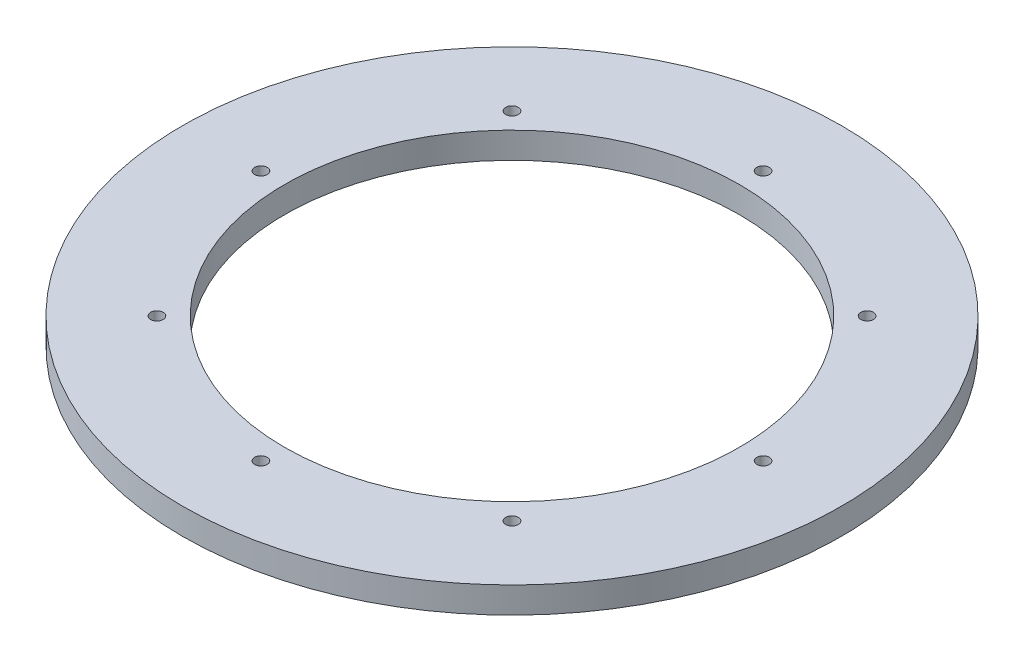
ISO-10303-21;
HEADER;
FILE_DESCRIPTION(('STEP AP214'),'2;1');
FILE_NAME('part.step','',(''),(''),'','','');
FILE_SCHEMA(('AUTOMOTIVE_DESIGN { 1 0 10303 214 1 1 1 1 }'));
ENDSEC;
DATA;
#1=APPLICATION_CONTEXT('core data for automotive mechanical design processes');
#2=APPLICATION_PROTOCOL_DEFINITION('international standard','automotive_design',2000,#1);
#3=PRODUCT_CONTEXT('',#1,'mechanical');
#4=PRODUCT('Part','Part','',(#3));
#5=PRODUCT_RELATED_PRODUCT_CATEGORY('part','',(#4));
#6=PRODUCT_DEFINITION_FORMATION('','',#4);
#7=PRODUCT_DEFINITION_CONTEXT('part definition',#1,'design');
#8=PRODUCT_DEFINITION('design','',#6,#7);
#9=PRODUCT_DEFINITION_SHAPE('','',#8);
#10=(LENGTH_UNIT() NAMED_UNIT(*) SI_UNIT(.MILLI.,.METRE.));
#11=(NAMED_UNIT(*) PLANE_ANGLE_UNIT() SI_UNIT($,.RADIAN.));
#12=(NAMED_UNIT(*) SI_UNIT($,.STERADIAN.) SOLID_ANGLE_UNIT());
#13=UNCERTAINTY_MEASURE_WITH_UNIT(LENGTH_MEASURE(1.E-05),#10,'distance_accuracy_value','');
#14=(GEOMETRIC_REPRESENTATION_CONTEXT(3) GLOBAL_UNCERTAINTY_ASSIGNED_CONTEXT((#13)) GLOBAL_UNIT_ASSIGNED_CONTEXT((#10,
#11,#12)) REPRESENTATION_CONTEXT('',''));
#15=CARTESIAN_POINT('',(0.,0.,0.));
#16=DIRECTION('',(0.,0.,1.));
#17=DIRECTION('',(1.,0.,0.));
#18=AXIS2_PLACEMENT_3D('',#15,#16,#17);
#19=CARTESIAN_POINT('',(0.,-12.5,0.));
#20=DIRECTION('',(0.,1.,0.));
#21=DIRECTION('',(0.,0.,1.));
#22=AXIS2_PLACEMENT_3D('',#19,#20,#21);
#23=PLANE('',#22);
#24=CARTESIAN_POINT('',(-169.705627484769,-12.5,-169.705627484773));
#25=DIRECTION('',(0.,1.,0.));
#26=DIRECTION('',(0.,0.,1.));
#27=AXIS2_PLACEMENT_3D('',#24,#25,#26);
#28=CIRCLE('',#27,6.00000000000001);
#29=CARTESIAN_POINT('',(-169.705627484769,-12.5,-163.705627484773));
#30=VERTEX_POINT('',#29);
#31=EDGE_CURVE('E95',#30,#30,#28,.T.);
#32=ORIENTED_EDGE('',*,*,#31,.T.);
#33=EDGE_LOOP('',(#32));
#34=FACE_BOUND('',#33,.T.);
#35=CARTESIAN_POINT('',(-240.,-12.5,-2.51386656396706E-12));
#36=DIRECTION('',(0.,1.,0.));
#37=DIRECTION('',(0.,0.,1.));
#38=AXIS2_PLACEMENT_3D('',#35,#36,#37);
#39=CIRCLE('',#38,6.);
#40=CARTESIAN_POINT('',(-240.,-12.5,5.99999999999749));
#41=VERTEX_POINT('',#40);
#42=EDGE_CURVE('E89',#41,#41,#39,.T.);
#43=ORIENTED_EDGE('',*,*,#42,.T.);
#44=EDGE_LOOP('',(#43));
#45=FACE_BOUND('',#44,.T.);
#46=CARTESIAN_POINT('',(-169.705627484773,-12.5,169.70562748477));
#47=DIRECTION('',(0.,1.,0.));
#48=DIRECTION('',(0.,0.,1.));
#49=AXIS2_PLACEMENT_3D('',#46,#47,#48);
#50=CIRCLE('',#49,6.00000000000001);
#51=CARTESIAN_POINT('',(-169.705627484773,-12.5,175.70562748477));
#52=VERTEX_POINT('',#51);
#53=EDGE_CURVE('E83',#52,#52,#50,.T.);
#54=ORIENTED_EDGE('',*,*,#53,.T.);
#55=EDGE_LOOP('',(#54));
#56=FACE_BOUND('',#55,.T.);
#57=CARTESIAN_POINT('',(-1.6759110426447E-12,-12.5,240.));
#58=DIRECTION('',(0.,1.,0.));
#59=DIRECTION('',(0.,0.,1.));
#60=AXIS2_PLACEMENT_3D('',#57,#58,#59);
#61=CIRCLE('',#60,6.00000000000001);
#62=CARTESIAN_POINT('',(-1.6759110426447E-12,-12.5,246.));
#63=VERTEX_POINT('',#62);
#64=EDGE_CURVE('E77',#63,#63,#61,.T.);
#65=ORIENTED_EDGE('',*,*,#64,.T.);
#66=EDGE_LOOP('',(#65));
#67=FACE_BOUND('',#66,.T.);
#68=CARTESIAN_POINT('',(169.70562748477,-12.5,169.705627484772));
#69=DIRECTION('',(0.,1.,0.));
#70=DIRECTION('',(0.,0.,1.));
#71=AXIS2_PLACEMENT_3D('',#68,#69,#70);
#72=CIRCLE('',#71,5.99999999999998);
#73=CARTESIAN_POINT('',(169.70562748477,-12.5,175.705627484772));
#74=VERTEX_POINT('',#73);
#75=EDGE_CURVE('E71',#74,#74,#72,.T.);
#76=ORIENTED_EDGE('',*,*,#75,.T.);
#77=EDGE_LOOP('',(#76));
#78=FACE_BOUND('',#77,.T.);
#79=CARTESIAN_POINT('',(240.,-12.5,8.37955521322352E-13));
#80=DIRECTION('',(0.,1.,0.));
#81=DIRECTION('',(0.,0.,1.));
#82=AXIS2_PLACEMENT_3D('',#79,#80,#81);
#83=CIRCLE('',#82,6.);
#84=CARTESIAN_POINT('',(240.,-12.5,6.00000000000084));
#85=VERTEX_POINT('',#84);
#86=EDGE_CURVE('E65',#85,#85,#83,.T.);
#87=ORIENTED_EDGE('',*,*,#86,.T.);
#88=EDGE_LOOP('',(#87));
#89=FACE_BOUND('',#88,.T.);
#90=CARTESIAN_POINT('',(169.705627484772,-12.5,-169.705627484771));
#91=DIRECTION('',(0.,1.,0.));
#92=DIRECTION('',(0.,0.,1.));
#93=AXIS2_PLACEMENT_3D('',#90,#91,#92);
#94=CIRCLE('',#93,5.99999999999998);
#95=CARTESIAN_POINT('',(169.705627484772,-12.5,-163.705627484771));
#96=VERTEX_POINT('',#95);
#97=EDGE_CURVE('E59',#96,#96,#94,.T.);
#98=ORIENTED_EDGE('',*,*,#97,.T.);
#99=EDGE_LOOP('',(#98));
#100=FACE_BOUND('',#99,.T.);
#101=CARTESIAN_POINT('',(0.,-12.5,-240.));
#102=DIRECTION('',(0.,1.,0.));
#103=DIRECTION('',(0.,0.,1.));
#104=AXIS2_PLACEMENT_3D('',#101,#102,#103);
#105=CIRCLE('',#104,6.);
#106=CARTESIAN_POINT('',(0.,-12.5,-234.));
#107=VERTEX_POINT('',#106);
#108=EDGE_CURVE('E53',#107,#107,#105,.T.);
#109=ORIENTED_EDGE('',*,*,#108,.T.);
#110=EDGE_LOOP('',(#109));
#111=FACE_BOUND('',#110,.T.);
#112=CARTESIAN_POINT('',(0.,-12.5,0.));
#113=DIRECTION('',(0.,1.,0.));
#114=DIRECTION('',(0.,0.,1.));
#115=AXIS2_PLACEMENT_3D('',#112,#113,#114);
#116=CIRCLE('',#115,217.5);
#117=CARTESIAN_POINT('',(0.,-12.5,217.5));
#118=VERTEX_POINT('',#117);
#119=EDGE_CURVE('E47',#118,#118,#116,.T.);
#120=ORIENTED_EDGE('',*,*,#119,.T.);
#121=EDGE_LOOP('',(#120));
#122=FACE_BOUND('',#121,.T.);
#123=CARTESIAN_POINT('',(0.,-12.5,0.));
#124=DIRECTION('',(0.,-1.,0.));
#125=DIRECTION('',(0.,0.,-1.));
#126=AXIS2_PLACEMENT_3D('',#123,#124,#125);
#127=CIRCLE('',#126,255.);
#128=CARTESIAN_POINT('',(0.,-12.5,-255.));
#129=VERTEX_POINT('',#128);
#130=EDGE_CURVE('E107',#129,#129,#127,.T.);
#131=ORIENTED_EDGE('',*,*,#130,.T.);
#132=EDGE_LOOP('',(#131));
#133=FACE_BOUND('',#132,.T.);
#134=ADVANCED_FACE('F34',(#34,#45,#56,#67,#78,#89,#100,#111,#122,#133),#23,.F.);
#135=CARTESIAN_POINT('',(0.,12.5,0.));
#136=DIRECTION('',(0.,1.,0.));
#137=DIRECTION('',(0.,0.,1.));
#138=AXIS2_PLACEMENT_3D('',#135,#136,#137);
#139=PLANE('',#138);
#140=CARTESIAN_POINT('',(-240.,12.5,-2.51386656396706E-12));
#141=DIRECTION('',(0.,1.,0.));
#142=DIRECTION('',(0.,0.,1.));
#143=AXIS2_PLACEMENT_3D('',#140,#141,#142);
#144=CIRCLE('',#143,6.);
#145=CARTESIAN_POINT('',(-240.,12.5,5.99999999999749));
#146=VERTEX_POINT('',#145);
#147=EDGE_CURVE('E86',#146,#146,#144,.T.);
#148=ORIENTED_EDGE('',*,*,#147,.F.);
#149=EDGE_LOOP('',(#148));
#150=FACE_BOUND('',#149,.T.);
#151=CARTESIAN_POINT('',(-1.6759110426447E-12,12.5,240.));
#152=DIRECTION('',(0.,1.,0.));
#153=DIRECTION('',(0.,0.,1.));
#154=AXIS2_PLACEMENT_3D('',#151,#152,#153);
#155=CIRCLE('',#154,6.00000000000001);
#156=CARTESIAN_POINT('',(-1.6759110426447E-12,12.5,246.));
#157=VERTEX_POINT('',#156);
#158=EDGE_CURVE('E74',#157,#157,#155,.T.);
#159=ORIENTED_EDGE('',*,*,#158,.F.);
#160=EDGE_LOOP('',(#159));
#161=FACE_BOUND('',#160,.T.);
#162=CARTESIAN_POINT('',(240.,12.5,8.37955521322352E-13));
#163=DIRECTION('',(0.,1.,0.));
#164=DIRECTION('',(0.,0.,1.));
#165=AXIS2_PLACEMENT_3D('',#162,#163,#164);
#166=CIRCLE('',#165,6.);
#167=CARTESIAN_POINT('',(240.,12.5,6.00000000000084));
#168=VERTEX_POINT('',#167);
#169=EDGE_CURVE('E62',#168,#168,#166,.T.);
#170=ORIENTED_EDGE('',*,*,#169,.F.);
#171=EDGE_LOOP('',(#170));
#172=FACE_BOUND('',#171,.T.);
#173=CARTESIAN_POINT('',(0.,12.5,-240.));
#174=DIRECTION('',(0.,1.,0.));
#175=DIRECTION('',(0.,0.,1.));
#176=AXIS2_PLACEMENT_3D('',#173,#174,#175);
#177=CIRCLE('',#176,6.);
#178=CARTESIAN_POINT('',(0.,12.5,-234.));
#179=VERTEX_POINT('',#178);
#180=EDGE_CURVE('E50',#179,#179,#177,.T.);
#181=ORIENTED_EDGE('',*,*,#180,.F.);
#182=EDGE_LOOP('',(#181));
#183=FACE_BOUND('',#182,.T.);
#184=CARTESIAN_POINT('',(0.,12.5,0.));
#185=DIRECTION('',(0.,1.,0.));
#186=DIRECTION('',(0.,0.,1.));
#187=AXIS2_PLACEMENT_3D('',#184,#185,#186);
#188=CIRCLE('',#187,315.);
#189=CARTESIAN_POINT('',(0.,12.5,315.));
#190=VERTEX_POINT('',#189);
#191=EDGE_CURVE('E10',#190,#190,#188,.T.);
#192=ORIENTED_EDGE('',*,*,#191,.T.);
#193=EDGE_LOOP('',(#192));
#194=FACE_BOUND('',#193,.T.);
#195=CARTESIAN_POINT('',(0.,12.5,0.));
#196=DIRECTION('',(0.,1.,0.));
#197=DIRECTION('',(0.,0.,1.));
#198=AXIS2_PLACEMENT_3D('',#195,#196,#197);
#199=CIRCLE('',#198,217.5);
#200=CARTESIAN_POINT('',(0.,12.5,217.5));
#201=VERTEX_POINT('',#200);
#202=EDGE_CURVE('E45',#201,#201,#199,.T.);
#203=ORIENTED_EDGE('',*,*,#202,.F.);
#204=EDGE_LOOP('',(#203));
#205=FACE_BOUND('',#204,.T.);
#206=CARTESIAN_POINT('',(169.705627484772,12.5,-169.705627484771));
#207=DIRECTION('',(0.,1.,0.));
#208=DIRECTION('',(0.,0.,1.));
#209=AXIS2_PLACEMENT_3D('',#206,#207,#208);
#210=CIRCLE('',#209,5.99999999999998);
#211=CARTESIAN_POINT('',(169.705627484772,12.5,-163.705627484771));
#212=VERTEX_POINT('',#211);
#213=EDGE_CURVE('E56',#212,#212,#210,.T.);
#214=ORIENTED_EDGE('',*,*,#213,.F.);
#215=EDGE_LOOP('',(#214));
#216=FACE_BOUND('',#215,.T.);
#217=CARTESIAN_POINT('',(169.70562748477,12.5,169.705627484772));
#218=DIRECTION('',(0.,1.,0.));
#219=DIRECTION('',(0.,0.,1.));
#220=AXIS2_PLACEMENT_3D('',#217,#218,#219);
#221=CIRCLE('',#220,5.99999999999998);
#222=CARTESIAN_POINT('',(169.70562748477,12.5,175.705627484772));
#223=VERTEX_POINT('',#222);
#224=EDGE_CURVE('E68',#223,#223,#221,.T.);
#225=ORIENTED_EDGE('',*,*,#224,.F.);
#226=EDGE_LOOP('',(#225));
#227=FACE_BOUND('',#226,.T.);
#228=CARTESIAN_POINT('',(-169.705627484773,12.5,169.70562748477));
#229=DIRECTION('',(0.,1.,0.));
#230=DIRECTION('',(0.,0.,1.));
#231=AXIS2_PLACEMENT_3D('',#228,#229,#230);
#232=CIRCLE('',#231,6.00000000000001);
#233=CARTESIAN_POINT('',(-169.705627484773,12.5,175.70562748477));
#234=VERTEX_POINT('',#233);
#235=EDGE_CURVE('E80',#234,#234,#232,.T.);
#236=ORIENTED_EDGE('',*,*,#235,.F.);
#237=EDGE_LOOP('',(#236));
#238=FACE_BOUND('',#237,.T.);
#239=CARTESIAN_POINT('',(-169.705627484769,12.5,-169.705627484773));
#240=DIRECTION('',(0.,1.,0.));
#241=DIRECTION('',(0.,0.,1.));
#242=AXIS2_PLACEMENT_3D('',#239,#240,#241);
#243=CIRCLE('',#242,6.00000000000001);
#244=CARTESIAN_POINT('',(-169.705627484769,12.5,-163.705627484773));
#245=VERTEX_POINT('',#244);
#246=EDGE_CURVE('E92',#245,#245,#243,.T.);
#247=ORIENTED_EDGE('',*,*,#246,.F.);
#248=EDGE_LOOP('',(#247));
#249=FACE_BOUND('',#248,.T.);
#250=ADVANCED_FACE('F132',(#150,#161,#172,#183,#194,#205,#216,#227,#238,#249),#139,.T.);
#251=CARTESIAN_POINT('',(0.,-12.5,0.));
#252=DIRECTION('',(0.,-1.,0.));
#253=DIRECTION('',(0.,0.,-1.));
#254=AXIS2_PLACEMENT_3D('',#251,#252,#253);
#255=CIRCLE('',#254,286.);
#256=CARTESIAN_POINT('',(0.,-12.5,-286.));
#257=VERTEX_POINT('',#256);
#258=EDGE_CURVE('E101',#257,#257,#255,.T.);
#259=ORIENTED_EDGE('',*,*,#258,.F.);
#260=EDGE_LOOP('',(#259));
#261=FACE_BOUND('',#260,.T.);
#262=CARTESIAN_POINT('',(0.,-12.5,0.));
#263=DIRECTION('',(0.,1.,0.));
#264=DIRECTION('',(0.,0.,1.));
#265=AXIS2_PLACEMENT_3D('',#262,#263,#264);
#266=CIRCLE('',#265,315.);
#267=CARTESIAN_POINT('',(0.,-12.5,315.));
#268=VERTEX_POINT('',#267);
#269=EDGE_CURVE('E38',#268,#268,#266,.T.);
#270=ORIENTED_EDGE('',*,*,#269,.F.);
#271=EDGE_LOOP('',(#270));
#272=FACE_BOUND('',#271,.T.);
#273=ADVANCED_FACE('F129',(#261,#272),#23,.F.);
#274=CARTESIAN_POINT('',(0.,12.5,0.));
#275=DIRECTION('',(0.,-1.,0.));
#276=DIRECTION('',(0.,0.,-1.));
#277=AXIS2_PLACEMENT_3D('',#274,#275,#276);
#278=CYLINDRICAL_SURFACE('',#277,315.);
#279=ORIENTED_EDGE('',*,*,#191,.F.);
#280=EDGE_LOOP('',(#279));
#281=FACE_BOUND('',#280,.T.);
#282=ORIENTED_EDGE('',*,*,#269,.T.);
#283=EDGE_LOOP('',(#282));
#284=FACE_BOUND('',#283,.T.);
#285=ADVANCED_FACE('F36',(#281,#284),#278,.T.);
#286=CARTESIAN_POINT('',(0.,12.5,0.));
#287=DIRECTION('',(0.,-1.,0.));
#288=DIRECTION('',(0.,0.,-1.));
#289=AXIS2_PLACEMENT_3D('',#286,#287,#288);
#290=CYLINDRICAL_SURFACE('',#289,217.5);
#291=ORIENTED_EDGE('',*,*,#202,.T.);
#292=EDGE_LOOP('',(#291));
#293=FACE_BOUND('',#292,.T.);
#294=ORIENTED_EDGE('',*,*,#119,.F.);
#295=EDGE_LOOP('',(#294));
#296=FACE_BOUND('',#295,.T.);
#297=ADVANCED_FACE('F136',(#293,#296),#290,.F.);
#298=CARTESIAN_POINT('',(0.,12.5,-240.));
#299=DIRECTION('',(0.,-1.,0.));
#300=DIRECTION('',(0.,0.,-1.));
#301=AXIS2_PLACEMENT_3D('',#298,#299,#300);
#302=CYLINDRICAL_SURFACE('',#301,6.);
#303=ORIENTED_EDGE('',*,*,#180,.T.);
#304=EDGE_LOOP('',(#303));
#305=FACE_BOUND('',#304,.T.);
#306=ORIENTED_EDGE('',*,*,#108,.F.);
#307=EDGE_LOOP('',(#306));
#308=FACE_BOUND('',#307,.T.);
#309=ADVANCED_FACE('F141',(#305,#308),#302,.F.);
#310=CARTESIAN_POINT('',(169.705627484772,12.5,-169.705627484771));
#311=DIRECTION('',(0.,-1.,0.));
#312=DIRECTION('',(0.,0.,-1.));
#313=AXIS2_PLACEMENT_3D('',#310,#311,#312);
#314=CYLINDRICAL_SURFACE('',#313,5.99999999999998);
#315=ORIENTED_EDGE('',*,*,#213,.T.);
#316=EDGE_LOOP('',(#315));
#317=FACE_BOUND('',#316,.T.);
#318=ORIENTED_EDGE('',*,*,#97,.F.);
#319=EDGE_LOOP('',(#318));
#320=FACE_BOUND('',#319,.T.);
#321=ADVANCED_FACE('F155',(#317,#320),#314,.F.);
#322=CARTESIAN_POINT('',(240.,12.5,8.37955521322352E-13));
#323=DIRECTION('',(0.,-1.,0.));
#324=DIRECTION('',(0.,0.,-1.));
#325=AXIS2_PLACEMENT_3D('',#322,#323,#324);
#326=CYLINDRICAL_SURFACE('',#325,6.);
#327=ORIENTED_EDGE('',*,*,#169,.T.);
#328=EDGE_LOOP('',(#327));
#329=FACE_BOUND('',#328,.T.);
#330=ORIENTED_EDGE('',*,*,#86,.F.);
#331=EDGE_LOOP('',(#330));
#332=FACE_BOUND('',#331,.T.);
#333=ADVANCED_FACE('F159',(#329,#332),#326,.F.);
#334=CARTESIAN_POINT('',(169.70562748477,12.5,169.705627484772));
#335=DIRECTION('',(0.,-1.,0.));
#336=DIRECTION('',(0.,0.,-1.));
#337=AXIS2_PLACEMENT_3D('',#334,#335,#336);
#338=CYLINDRICAL_SURFACE('',#337,5.99999999999998);
#339=ORIENTED_EDGE('',*,*,#224,.T.);
#340=EDGE_LOOP('',(#339));
#341=FACE_BOUND('',#340,.T.);
#342=ORIENTED_EDGE('',*,*,#75,.F.);
#343=EDGE_LOOP('',(#342));
#344=FACE_BOUND('',#343,.T.);
#345=ADVANCED_FACE('F163',(#341,#344),#338,.F.);
#346=CARTESIAN_POINT('',(-1.6759110426447E-12,12.5,240.));
#347=DIRECTION('',(0.,-1.,0.));
#348=DIRECTION('',(0.,0.,-1.));
#349=AXIS2_PLACEMENT_3D('',#346,#347,#348);
#350=CYLINDRICAL_SURFACE('',#349,6.00000000000001);
#351=ORIENTED_EDGE('',*,*,#158,.T.);
#352=EDGE_LOOP('',(#351));
#353=FACE_BOUND('',#352,.T.);
#354=ORIENTED_EDGE('',*,*,#64,.F.);
#355=EDGE_LOOP('',(#354));
#356=FACE_BOUND('',#355,.T.);
#357=ADVANCED_FACE('F167',(#353,#356),#350,.F.);
#358=CARTESIAN_POINT('',(-169.705627484773,12.5,169.70562748477));
#359=DIRECTION('',(0.,-1.,0.));
#360=DIRECTION('',(0.,0.,-1.));
#361=AXIS2_PLACEMENT_3D('',#358,#359,#360);
#362=CYLINDRICAL_SURFACE('',#361,6.00000000000001);
#363=ORIENTED_EDGE('',*,*,#235,.T.);
#364=EDGE_LOOP('',(#363));
#365=FACE_BOUND('',#364,.T.);
#366=ORIENTED_EDGE('',*,*,#53,.F.);
#367=EDGE_LOOP('',(#366));
#368=FACE_BOUND('',#367,.T.);
#369=ADVANCED_FACE('F171',(#365,#368),#362,.F.);
#370=CARTESIAN_POINT('',(-240.,12.5,-2.51386656396706E-12));
#371=DIRECTION('',(0.,-1.,0.));
#372=DIRECTION('',(0.,0.,-1.));
#373=AXIS2_PLACEMENT_3D('',#370,#371,#372);
#374=CYLINDRICAL_SURFACE('',#373,6.);
#375=ORIENTED_EDGE('',*,*,#147,.T.);
#376=EDGE_LOOP('',(#375));
#377=FACE_BOUND('',#376,.T.);
#378=ORIENTED_EDGE('',*,*,#42,.F.);
#379=EDGE_LOOP('',(#378));
#380=FACE_BOUND('',#379,.T.);
#381=ADVANCED_FACE('F175',(#377,#380),#374,.F.);
#382=CARTESIAN_POINT('',(-169.705627484769,12.5,-169.705627484773));
#383=DIRECTION('',(0.,-1.,0.));
#384=DIRECTION('',(0.,0.,-1.));
#385=AXIS2_PLACEMENT_3D('',#382,#383,#384);
#386=CYLINDRICAL_SURFACE('',#385,6.00000000000001);
#387=ORIENTED_EDGE('',*,*,#246,.T.);
#388=EDGE_LOOP('',(#387));
#389=FACE_BOUND('',#388,.T.);
#390=ORIENTED_EDGE('',*,*,#31,.F.);
#391=EDGE_LOOP('',(#390));
#392=FACE_BOUND('',#391,.T.);
#393=ADVANCED_FACE('F125',(#389,#392),#386,.F.);
#394=CARTESIAN_POINT('',(0.,-0.5,0.));
#395=DIRECTION('',(0.,-1.,0.));
#396=DIRECTION('',(0.,0.,-1.));
#397=AXIS2_PLACEMENT_3D('',#394,#395,#396);
#398=CYLINDRICAL_SURFACE('',#397,286.);
#399=CARTESIAN_POINT('',(0.,-0.5,0.));
#400=DIRECTION('',(0.,-1.,0.));
#401=DIRECTION('',(0.,0.,-1.));
#402=AXIS2_PLACEMENT_3D('',#399,#400,#401);
#403=CIRCLE('',#402,286.);
#404=CARTESIAN_POINT('',(0.,-0.5,-286.));
#405=VERTEX_POINT('',#404);
#406=EDGE_CURVE('E98',#405,#405,#403,.T.);
#407=ORIENTED_EDGE('',*,*,#406,.F.);
#408=EDGE_LOOP('',(#407));
#409=FACE_BOUND('',#408,.T.);
#410=ORIENTED_EDGE('',*,*,#258,.T.);
#411=EDGE_LOOP('',(#410));
#412=FACE_BOUND('',#411,.T.);
#413=ADVANCED_FACE('F119',(#409,#412),#398,.F.);
#414=CARTESIAN_POINT('',(0.,-0.5,0.));
#415=DIRECTION('',(0.,-1.,0.));
#416=DIRECTION('',(0.,0.,-1.));
#417=AXIS2_PLACEMENT_3D('',#414,#415,#416);
#418=PLANE('',#417);
#419=CARTESIAN_POINT('',(0.,-0.5,0.));
#420=DIRECTION('',(0.,-1.,0.));
#421=DIRECTION('',(0.,0.,-1.));
#422=AXIS2_PLACEMENT_3D('',#419,#420,#421);
#423=CIRCLE('',#422,255.);
#424=CARTESIAN_POINT('',(0.,-0.5,-255.));
#425=VERTEX_POINT('',#424);
#426=EDGE_CURVE('E104',#425,#425,#423,.T.);
#427=ORIENTED_EDGE('',*,*,#426,.F.);
#428=EDGE_LOOP('',(#427));
#429=FACE_BOUND('',#428,.T.);
#430=ORIENTED_EDGE('',*,*,#406,.T.);
#431=EDGE_LOOP('',(#430));
#432=FACE_BOUND('',#431,.T.);
#433=ADVANCED_FACE('F116',(#429,#432),#418,.T.);
#434=CARTESIAN_POINT('',(0.,-0.5,0.));
#435=DIRECTION('',(0.,-1.,0.));
#436=DIRECTION('',(0.,0.,-1.));
#437=AXIS2_PLACEMENT_3D('',#434,#435,#436);
#438=CYLINDRICAL_SURFACE('',#437,255.);
#439=ORIENTED_EDGE('',*,*,#426,.T.);
#440=EDGE_LOOP('',(#439));
#441=FACE_BOUND('',#440,.T.);
#442=ORIENTED_EDGE('',*,*,#130,.F.);
#443=EDGE_LOOP('',(#442));
#444=FACE_BOUND('',#443,.T.);
#445=ADVANCED_FACE('F113',(#441,#444),#438,.T.);
#446=CLOSED_SHELL('',(#134,#250,#273,#285,#297,#309,#321,#333,#345,#357,#369,#381,#393,#413,
#433,#445));
#447=MANIFOLD_SOLID_BREP('B2',#446);
#448=ADVANCED_BREP_SHAPE_REPRESENTATION('',(#18,#447),#14);
#449=SHAPE_DEFINITION_REPRESENTATION(#9,#448);
ENDSEC;
END-ISO-10303-21;
